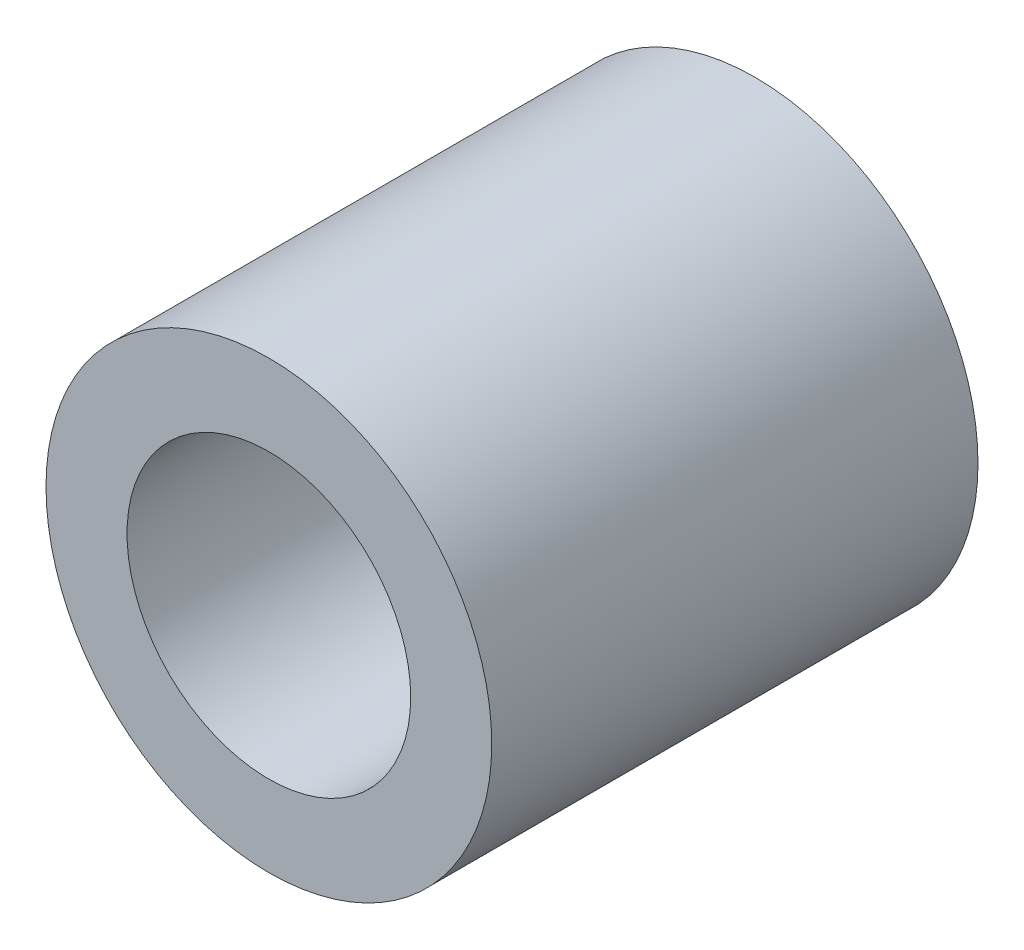
ISO-10303-21;
HEADER;
FILE_DESCRIPTION(('STEP AP214'),'2;1');
FILE_NAME('part.step','',(''),(''),'','','');
FILE_SCHEMA(('AUTOMOTIVE_DESIGN { 1 0 10303 214 1 1 1 1 }'));
ENDSEC;
DATA;
#1=APPLICATION_CONTEXT('core data for automotive mechanical design processes');
#2=APPLICATION_PROTOCOL_DEFINITION('international standard','automotive_design',2000,#1);
#3=PRODUCT_CONTEXT('',#1,'mechanical');
#4=PRODUCT('Part','Part','',(#3));
#5=PRODUCT_RELATED_PRODUCT_CATEGORY('part','',(#4));
#6=PRODUCT_DEFINITION_FORMATION('','',#4);
#7=PRODUCT_DEFINITION_CONTEXT('part definition',#1,'design');
#8=PRODUCT_DEFINITION('design','',#6,#7);
#9=PRODUCT_DEFINITION_SHAPE('','',#8);
#10=(LENGTH_UNIT() NAMED_UNIT(*) SI_UNIT(.MILLI.,.METRE.));
#11=(NAMED_UNIT(*) PLANE_ANGLE_UNIT() SI_UNIT($,.RADIAN.));
#12=(NAMED_UNIT(*) SI_UNIT($,.STERADIAN.) SOLID_ANGLE_UNIT());
#13=UNCERTAINTY_MEASURE_WITH_UNIT(LENGTH_MEASURE(1.E-05),#10,'distance_accuracy_value','');
#14=(GEOMETRIC_REPRESENTATION_CONTEXT(3) GLOBAL_UNCERTAINTY_ASSIGNED_CONTEXT((#13)) GLOBAL_UNIT_ASSIGNED_CONTEXT((#10,
#11,#12)) REPRESENTATION_CONTEXT('',''));
#15=CARTESIAN_POINT('',(0.,0.,0.));
#16=DIRECTION('',(0.,0.,1.));
#17=DIRECTION('',(1.,0.,0.));
#18=AXIS2_PLACEMENT_3D('',#15,#16,#17);
#19=CARTESIAN_POINT('',(0.,0.,20.));
#20=DIRECTION('',(0.,0.,-1.));
#21=DIRECTION('',(-1.,0.,0.));
#22=AXIS2_PLACEMENT_3D('',#19,#20,#21);
#23=CYLINDRICAL_SURFACE('',#22,5.5);
#24=CARTESIAN_POINT('',(0.,0.,0.));
#25=DIRECTION('',(0.,0.,1.));
#26=DIRECTION('',(1.,0.,0.));
#27=AXIS2_PLACEMENT_3D('',#24,#25,#26);
#28=CIRCLE('',#27,5.5);
#29=CARTESIAN_POINT('',(5.5,0.,0.));
#30=VERTEX_POINT('',#29);
#31=EDGE_CURVE('E10',#30,#30,#28,.T.);
#32=ORIENTED_EDGE('',*,*,#31,.T.);
#33=EDGE_LOOP('',(#32));
#34=FACE_BOUND('',#33,.T.);
#35=CARTESIAN_POINT('',(0.,0.,12.));
#36=DIRECTION('',(0.,0.,1.));
#37=DIRECTION('',(1.,0.,0.));
#38=AXIS2_PLACEMENT_3D('',#35,#36,#37);
#39=CIRCLE('',#38,5.5);
#40=CARTESIAN_POINT('',(5.5,0.,12.));
#41=VERTEX_POINT('',#40);
#42=EDGE_CURVE('E55',#41,#41,#39,.T.);
#43=ORIENTED_EDGE('',*,*,#42,.F.);
#44=EDGE_LOOP('',(#43));
#45=FACE_BOUND('',#44,.T.);
#46=ADVANCED_FACE('F30',(#34,#45),#23,.T.);
#47=CARTESIAN_POINT('',(0.,0.,-4.89949493661166));
#48=DIRECTION('',(0.,0.,1.));
#49=DIRECTION('',(1.,0.,0.));
#50=AXIS2_PLACEMENT_3D('',#47,#48,#49);
#51=CYLINDRICAL_SURFACE('',#50,3.5);
#52=CARTESIAN_POINT('',(0.,0.,5.));
#53=DIRECTION('',(0.,0.,1.));
#54=DIRECTION('',(1.,0.,0.));
#55=AXIS2_PLACEMENT_3D('',#52,#53,#54);
#56=CIRCLE('',#55,3.5);
#57=CARTESIAN_POINT('',(3.5,0.,5.));
#58=VERTEX_POINT('',#57);
#59=EDGE_CURVE('E50',#58,#58,#56,.F.);
#60=ORIENTED_EDGE('',*,*,#59,.T.);
#61=EDGE_LOOP('',(#60));
#62=FACE_BOUND('',#61,.T.);
#63=CARTESIAN_POINT('',(0.,0.,12.));
#64=DIRECTION('',(0.,0.,1.));
#65=DIRECTION('',(1.,0.,0.));
#66=AXIS2_PLACEMENT_3D('',#63,#64,#65);
#67=CIRCLE('',#66,3.5);
#68=CARTESIAN_POINT('',(3.5,0.,12.));
#69=VERTEX_POINT('',#68);
#70=EDGE_CURVE('E33',#69,#69,#67,.F.);
#71=ORIENTED_EDGE('',*,*,#70,.F.);
#72=EDGE_LOOP('',(#71));
#73=FACE_BOUND('',#72,.T.);
#74=ADVANCED_FACE('F64',(#62,#73),#51,.F.);
#75=CARTESIAN_POINT('',(0.,0.,20.));
#76=DIRECTION('',(0.,0.,-1.));
#77=DIRECTION('',(-1.,0.,0.));
#78=AXIS2_PLACEMENT_3D('',#75,#76,#77);
#79=CYLINDRICAL_SURFACE('',#78,2.5);
#80=CARTESIAN_POINT('',(0.,0.,0.));
#81=DIRECTION('',(0.,0.,1.));
#82=DIRECTION('',(1.,0.,0.));
#83=AXIS2_PLACEMENT_3D('',#80,#81,#82);
#84=CIRCLE('',#83,2.5);
#85=CARTESIAN_POINT('',(2.5,0.,0.));
#86=VERTEX_POINT('',#85);
#87=EDGE_CURVE('E37',#86,#86,#84,.T.);
#88=ORIENTED_EDGE('',*,*,#87,.F.);
#89=EDGE_LOOP('',(#88));
#90=FACE_BOUND('',#89,.T.);
#91=CARTESIAN_POINT('',(0.,0.,3.));
#92=DIRECTION('',(0.,0.,1.));
#93=DIRECTION('',(1.,0.,0.));
#94=AXIS2_PLACEMENT_3D('',#91,#92,#93);
#95=CIRCLE('',#94,2.5);
#96=CARTESIAN_POINT('',(2.5,0.,3.));
#97=VERTEX_POINT('',#96);
#98=EDGE_CURVE('E41',#97,#97,#95,.T.);
#99=ORIENTED_EDGE('',*,*,#98,.T.);
#100=EDGE_LOOP('',(#99));
#101=FACE_BOUND('',#100,.T.);
#102=ADVANCED_FACE('F66',(#90,#101),#79,.F.);
#103=CARTESIAN_POINT('',(0.,0.,0.));
#104=DIRECTION('',(0.,0.,1.));
#105=DIRECTION('',(1.,0.,0.));
#106=AXIS2_PLACEMENT_3D('',#103,#104,#105);
#107=PLANE('',#106);
#108=ORIENTED_EDGE('',*,*,#31,.F.);
#109=EDGE_LOOP('',(#108));
#110=FACE_BOUND('',#109,.T.);
#111=ORIENTED_EDGE('',*,*,#87,.T.);
#112=EDGE_LOOP('',(#111));
#113=FACE_BOUND('',#112,.T.);
#114=ADVANCED_FACE('F73',(#110,#113),#107,.F.);
#115=CARTESIAN_POINT('',(0.,0.,5.));
#116=DIRECTION('',(0.,0.,1.));
#117=DIRECTION('',(1.,0.,0.));
#118=AXIS2_PLACEMENT_3D('',#115,#116,#117);
#119=PLANE('',#118);
#120=CARTESIAN_POINT('',(0.,0.,5.));
#121=DIRECTION('',(0.,0.,1.));
#122=DIRECTION('',(1.,0.,0.));
#123=AXIS2_PLACEMENT_3D('',#120,#121,#122);
#124=CIRCLE('',#123,1.);
#125=CARTESIAN_POINT('',(1.,0.,5.));
#126=VERTEX_POINT('',#125);
#127=EDGE_CURVE('E47',#126,#126,#124,.T.);
#128=ORIENTED_EDGE('',*,*,#127,.F.);
#129=EDGE_LOOP('',(#128));
#130=FACE_BOUND('',#129,.T.);
#131=ORIENTED_EDGE('',*,*,#59,.F.);
#132=EDGE_LOOP('',(#131));
#133=FACE_BOUND('',#132,.T.);
#134=ADVANCED_FACE('F85',(#130,#133),#119,.T.);
#135=CARTESIAN_POINT('',(0.,0.,3.));
#136=DIRECTION('',(0.,0.,1.));
#137=DIRECTION('',(1.,0.,0.));
#138=AXIS2_PLACEMENT_3D('',#135,#136,#137);
#139=PLANE('',#138);
#140=CARTESIAN_POINT('',(0.,0.,3.));
#141=DIRECTION('',(0.,0.,1.));
#142=DIRECTION('',(1.,0.,0.));
#143=AXIS2_PLACEMENT_3D('',#140,#141,#142);
#144=CIRCLE('',#143,1.);
#145=CARTESIAN_POINT('',(1.,0.,3.));
#146=VERTEX_POINT('',#145);
#147=EDGE_CURVE('E46',#146,#146,#144,.T.);
#148=ORIENTED_EDGE('',*,*,#147,.T.);
#149=EDGE_LOOP('',(#148));
#150=FACE_BOUND('',#149,.T.);
#151=ORIENTED_EDGE('',*,*,#98,.F.);
#152=EDGE_LOOP('',(#151));
#153=FACE_BOUND('',#152,.T.);
#154=ADVANCED_FACE('F81',(#150,#153),#139,.F.);
#155=CARTESIAN_POINT('',(0.,0.,3.));
#156=DIRECTION('',(0.,0.,1.));
#157=DIRECTION('',(1.,0.,0.));
#158=AXIS2_PLACEMENT_3D('',#155,#156,#157);
#159=CYLINDRICAL_SURFACE('',#158,1.);
#160=ORIENTED_EDGE('',*,*,#147,.F.);
#161=EDGE_LOOP('',(#160));
#162=FACE_BOUND('',#161,.T.);
#163=ORIENTED_EDGE('',*,*,#127,.T.);
#164=EDGE_LOOP('',(#163));
#165=FACE_BOUND('',#164,.T.);
#166=ADVANCED_FACE('F78',(#162,#165),#159,.F.);
#167=CARTESIAN_POINT('',(0.,0.,12.));
#168=DIRECTION('',(0.,0.,1.));
#169=DIRECTION('',(1.,0.,0.));
#170=AXIS2_PLACEMENT_3D('',#167,#168,#169);
#171=PLANE('',#170);
#172=ORIENTED_EDGE('',*,*,#70,.T.);
#173=EDGE_LOOP('',(#172));
#174=FACE_BOUND('',#173,.T.);
#175=ORIENTED_EDGE('',*,*,#42,.T.);
#176=EDGE_LOOP('',(#175));
#177=FACE_BOUND('',#176,.T.);
#178=ADVANCED_FACE('F62',(#174,#177),#171,.T.);
#179=CLOSED_SHELL('',(#46,#74,#102,#114,#134,#154,#166,#178));
#180=MANIFOLD_SOLID_BREP('B2',#179);
#181=ADVANCED_BREP_SHAPE_REPRESENTATION('',(#18,#180),#14);
#182=SHAPE_DEFINITION_REPRESENTATION(#9,#181);
ENDSEC;
END-ISO-10303-21;
